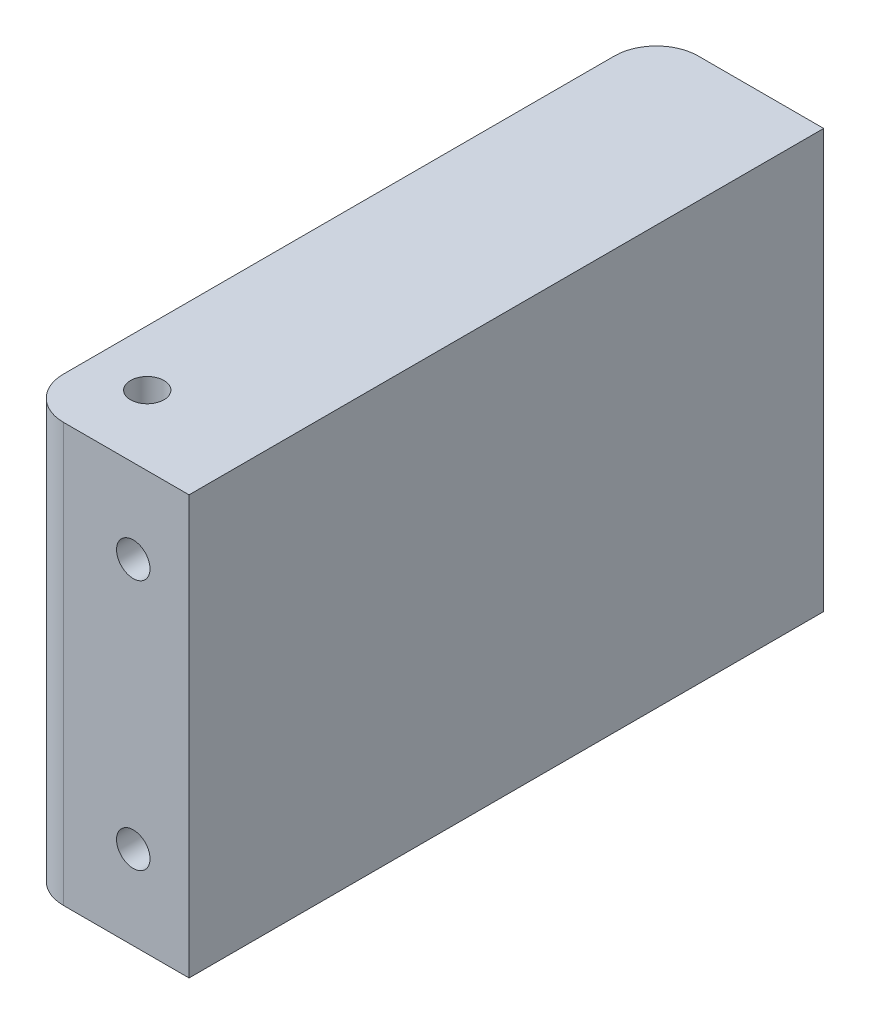
ISO-10303-21;
HEADER;
FILE_DESCRIPTION(('STEP AP214'),'2;1');
FILE_NAME('part.step','',(''),(''),'','','');
FILE_SCHEMA(('AUTOMOTIVE_DESIGN { 1 0 10303 214 1 1 1 1 }'));
ENDSEC;
DATA;
#1=APPLICATION_CONTEXT('core data for automotive mechanical design processes');
#2=APPLICATION_PROTOCOL_DEFINITION('international standard','automotive_design',2000,#1);
#3=PRODUCT_CONTEXT('',#1,'mechanical');
#4=PRODUCT('Part','Part','',(#3));
#5=PRODUCT_RELATED_PRODUCT_CATEGORY('part','',(#4));
#6=PRODUCT_DEFINITION_FORMATION('','',#4);
#7=PRODUCT_DEFINITION_CONTEXT('part definition',#1,'design');
#8=PRODUCT_DEFINITION('design','',#6,#7);
#9=PRODUCT_DEFINITION_SHAPE('','',#8);
#10=(LENGTH_UNIT() NAMED_UNIT(*) SI_UNIT(.MILLI.,.METRE.));
#11=(NAMED_UNIT(*) PLANE_ANGLE_UNIT() SI_UNIT($,.RADIAN.));
#12=(NAMED_UNIT(*) SI_UNIT($,.STERADIAN.) SOLID_ANGLE_UNIT());
#13=UNCERTAINTY_MEASURE_WITH_UNIT(LENGTH_MEASURE(1.E-05),#10,'distance_accuracy_value','');
#14=(GEOMETRIC_REPRESENTATION_CONTEXT(3) GLOBAL_UNCERTAINTY_ASSIGNED_CONTEXT((#13)) GLOBAL_UNIT_ASSIGNED_CONTEXT((#10,
#11,#12)) REPRESENTATION_CONTEXT('',''));
#15=CARTESIAN_POINT('',(0.,0.,0.));
#16=DIRECTION('',(0.,0.,1.));
#17=DIRECTION('',(1.,0.,0.));
#18=AXIS2_PLACEMENT_3D('',#15,#16,#17);
#19=CARTESIAN_POINT('',(0.,15.,0.));
#20=DIRECTION('',(0.,1.,0.));
#21=DIRECTION('',(0.,0.,1.));
#22=AXIS2_PLACEMENT_3D('',#19,#20,#21);
#23=PLANE('',#22);
#24=DIRECTION('',(-1.,0.,0.));
#25=VECTOR('',#24,1.);
#26=CARTESIAN_POINT('',(-6.,15.,-45.5));
#27=LINE('',#26,#25);
#28=CARTESIAN_POINT('',(6.,15.,-45.5));
#29=VERTEX_POINT('',#28);
#30=CARTESIAN_POINT('',(-3.,15.,-45.5));
#31=VERTEX_POINT('',#30);
#32=EDGE_CURVE('E112',#29,#31,#27,.T.);
#33=ORIENTED_EDGE('',*,*,#32,.T.);
#34=CARTESIAN_POINT('',(-3.,15.,-42.5));
#35=DIRECTION('',(0.,1.,0.));
#36=DIRECTION('',(0.,0.,1.));
#37=AXIS2_PLACEMENT_3D('',#34,#35,#36);
#38=CIRCLE('',#37,3.);
#39=CARTESIAN_POINT('',(-6.,15.,-42.5));
#40=VERTEX_POINT('',#39);
#41=EDGE_CURVE('E45',#31,#40,#38,.T.);
#42=ORIENTED_EDGE('',*,*,#41,.T.);
#43=DIRECTION('',(0.,0.,1.));
#44=VECTOR('',#43,1.);
#45=CARTESIAN_POINT('',(-6.,15.,-45.5));
#46=LINE('',#45,#44);
#47=CARTESIAN_POINT('',(-6.,15.,-3.));
#48=VERTEX_POINT('',#47);
#49=EDGE_CURVE('E98',#40,#48,#46,.T.);
#50=ORIENTED_EDGE('',*,*,#49,.T.);
#51=CARTESIAN_POINT('',(-3.,15.,-3.));
#52=DIRECTION('',(0.,1.,0.));
#53=DIRECTION('',(0.,0.,1.));
#54=AXIS2_PLACEMENT_3D('',#51,#52,#53);
#55=CIRCLE('',#54,3.);
#56=CARTESIAN_POINT('',(-3.,15.,0.));
#57=VERTEX_POINT('',#56);
#58=EDGE_CURVE('E52',#48,#57,#55,.T.);
#59=ORIENTED_EDGE('',*,*,#58,.T.);
#60=DIRECTION('',(1.,0.,0.));
#61=VECTOR('',#60,1.);
#62=CARTESIAN_POINT('',(-6.,15.,0.));
#63=LINE('',#62,#61);
#64=CARTESIAN_POINT('',(6.,15.,0.));
#65=VERTEX_POINT('',#64);
#66=EDGE_CURVE('E90',#57,#65,#63,.T.);
#67=ORIENTED_EDGE('',*,*,#66,.T.);
#68=DIRECTION('',(0.,0.,-1.));
#69=VECTOR('',#68,1.);
#70=CARTESIAN_POINT('',(6.,15.,-45.5));
#71=LINE('',#70,#69);
#72=EDGE_CURVE('E94',#65,#29,#71,.T.);
#73=ORIENTED_EDGE('',*,*,#72,.T.);
#74=EDGE_LOOP('',(#33,#42,#50,#59,#67,#73));
#75=FACE_BOUND('',#74,.T.);
#76=CARTESIAN_POINT('',(-2.,15.,-5.));
#77=DIRECTION('',(0.,1.,0.));
#78=DIRECTION('',(0.,0.,1.));
#79=AXIS2_PLACEMENT_3D('',#76,#77,#78);
#80=CIRCLE('',#79,1.2);
#81=CARTESIAN_POINT('',(-2.,15.,-3.8));
#82=VERTEX_POINT('',#81);
#83=EDGE_CURVE('E120',#82,#82,#80,.T.);
#84=ORIENTED_EDGE('',*,*,#83,.F.);
#85=EDGE_LOOP('',(#84));
#86=FACE_BOUND('',#85,.T.);
#87=ADVANCED_FACE('F37',(#75,#86),#23,.T.);
#88=CARTESIAN_POINT('',(0.,-15.,0.));
#89=DIRECTION('',(0.,1.,0.));
#90=DIRECTION('',(0.,0.,1.));
#91=AXIS2_PLACEMENT_3D('',#88,#89,#90);
#92=PLANE('',#91);
#93=DIRECTION('',(0.,0.,1.));
#94=VECTOR('',#93,1.);
#95=CARTESIAN_POINT('',(-6.,-15.,-45.5));
#96=LINE('',#95,#94);
#97=CARTESIAN_POINT('',(-6.,-15.,-42.5));
#98=VERTEX_POINT('',#97);
#99=CARTESIAN_POINT('',(-6.,-15.,-3.));
#100=VERTEX_POINT('',#99);
#101=EDGE_CURVE('E117',#98,#100,#96,.T.);
#102=ORIENTED_EDGE('',*,*,#101,.F.);
#103=CARTESIAN_POINT('',(-3.,-15.,-42.5));
#104=DIRECTION('',(0.,1.,0.));
#105=DIRECTION('',(0.,0.,1.));
#106=AXIS2_PLACEMENT_3D('',#103,#104,#105);
#107=CIRCLE('',#106,3.);
#108=CARTESIAN_POINT('',(-3.,-15.,-45.5));
#109=VERTEX_POINT('',#108);
#110=EDGE_CURVE('E133',#98,#109,#107,.F.);
#111=ORIENTED_EDGE('',*,*,#110,.T.);
#112=DIRECTION('',(-1.,0.,0.));
#113=VECTOR('',#112,1.);
#114=CARTESIAN_POINT('',(-6.,-15.,-45.5));
#115=LINE('',#114,#113);
#116=CARTESIAN_POINT('',(6.,-15.,-45.5));
#117=VERTEX_POINT('',#116);
#118=EDGE_CURVE('E124',#117,#109,#115,.T.);
#119=ORIENTED_EDGE('',*,*,#118,.F.);
#120=DIRECTION('',(0.,0.,-1.));
#121=VECTOR('',#120,1.);
#122=CARTESIAN_POINT('',(6.,-15.,-45.5));
#123=LINE('',#122,#121);
#124=CARTESIAN_POINT('',(6.,-15.,0.));
#125=VERTEX_POINT('',#124);
#126=EDGE_CURVE('E122',#125,#117,#123,.T.);
#127=ORIENTED_EDGE('',*,*,#126,.F.);
#128=DIRECTION('',(1.,0.,0.));
#129=VECTOR('',#128,1.);
#130=CARTESIAN_POINT('',(-6.,-15.,0.));
#131=LINE('',#130,#129);
#132=CARTESIAN_POINT('',(-3.,-15.,0.));
#133=VERTEX_POINT('',#132);
#134=EDGE_CURVE('E104',#133,#125,#131,.T.);
#135=ORIENTED_EDGE('',*,*,#134,.F.);
#136=CARTESIAN_POINT('',(-3.,-15.,-3.));
#137=DIRECTION('',(0.,1.,0.));
#138=DIRECTION('',(0.,0.,1.));
#139=AXIS2_PLACEMENT_3D('',#136,#137,#138);
#140=CIRCLE('',#139,3.);
#141=EDGE_CURVE('E131',#133,#100,#140,.F.);
#142=ORIENTED_EDGE('',*,*,#141,.T.);
#143=EDGE_LOOP('',(#102,#111,#119,#127,#135,#142));
#144=FACE_BOUND('',#143,.T.);
#145=CARTESIAN_POINT('',(-2.,-15.,-5.));
#146=DIRECTION('',(0.,1.,0.));
#147=DIRECTION('',(0.,0.,1.));
#148=AXIS2_PLACEMENT_3D('',#145,#146,#147);
#149=CIRCLE('',#148,1.2);
#150=CARTESIAN_POINT('',(-2.,-15.,-3.8));
#151=VERTEX_POINT('',#150);
#152=EDGE_CURVE('E194',#151,#151,#149,.T.);
#153=ORIENTED_EDGE('',*,*,#152,.T.);
#154=EDGE_LOOP('',(#153));
#155=FACE_BOUND('',#154,.T.);
#156=ADVANCED_FACE('F147',(#144,#155),#92,.F.);
#157=CARTESIAN_POINT('',(-6.,15.,-45.5));
#158=DIRECTION('',(1.,0.,0.));
#159=DIRECTION('',(0.,0.,-1.));
#160=AXIS2_PLACEMENT_3D('',#157,#158,#159);
#161=PLANE('',#160);
#162=ORIENTED_EDGE('',*,*,#49,.F.);
#163=DIRECTION('',(0.,-1.,0.));
#164=VECTOR('',#163,1.);
#165=CARTESIAN_POINT('',(-6.,15.,-42.5));
#166=LINE('',#165,#164);
#167=EDGE_CURVE('E128',#40,#98,#166,.T.);
#168=ORIENTED_EDGE('',*,*,#167,.T.);
#169=ORIENTED_EDGE('',*,*,#101,.T.);
#170=DIRECTION('',(0.,-1.,0.));
#171=VECTOR('',#170,1.);
#172=CARTESIAN_POINT('',(-6.,15.,-3.));
#173=LINE('',#172,#171);
#174=EDGE_CURVE('E107',#100,#48,#173,.F.);
#175=ORIENTED_EDGE('',*,*,#174,.T.);
#176=EDGE_LOOP('',(#162,#168,#169,#175));
#177=FACE_BOUND('',#176,.T.);
#178=ADVANCED_FACE('F141',(#177),#161,.F.);
#179=CARTESIAN_POINT('',(-6.,15.,0.));
#180=DIRECTION('',(0.,0.,-1.));
#181=DIRECTION('',(-1.,0.,0.));
#182=AXIS2_PLACEMENT_3D('',#179,#180,#181);
#183=PLANE('',#182);
#184=CARTESIAN_POINT('',(2.,-9.,0.));
#185=DIRECTION('',(0.,0.,1.));
#186=DIRECTION('',(-1.,0.,0.));
#187=AXIS2_PLACEMENT_3D('',#184,#185,#186);
#188=CIRCLE('',#187,1.2);
#189=CARTESIAN_POINT('',(0.799999999999998,-9.,0.));
#190=VERTEX_POINT('',#189);
#191=EDGE_CURVE('E185',#190,#190,#188,.T.);
#192=ORIENTED_EDGE('',*,*,#191,.F.);
#193=EDGE_LOOP('',(#192));
#194=FACE_BOUND('',#193,.T.);
#195=CARTESIAN_POINT('',(2.,9.,0.));
#196=DIRECTION('',(0.,0.,1.));
#197=DIRECTION('',(1.,0.,0.));
#198=AXIS2_PLACEMENT_3D('',#195,#196,#197);
#199=CIRCLE('',#198,1.2);
#200=CARTESIAN_POINT('',(3.2,9.,0.));
#201=VERTEX_POINT('',#200);
#202=EDGE_CURVE('E188',#201,#201,#199,.T.);
#203=ORIENTED_EDGE('',*,*,#202,.F.);
#204=EDGE_LOOP('',(#203));
#205=FACE_BOUND('',#204,.T.);
#206=ORIENTED_EDGE('',*,*,#66,.F.);
#207=DIRECTION('',(0.,-1.,0.));
#208=VECTOR('',#207,1.);
#209=CARTESIAN_POINT('',(-3.,15.,0.));
#210=LINE('',#209,#208);
#211=EDGE_CURVE('E11',#57,#133,#210,.T.);
#212=ORIENTED_EDGE('',*,*,#211,.T.);
#213=ORIENTED_EDGE('',*,*,#134,.T.);
#214=DIRECTION('',(0.,-1.,0.));
#215=VECTOR('',#214,1.);
#216=CARTESIAN_POINT('',(6.,15.,0.));
#217=LINE('',#216,#215);
#218=EDGE_CURVE('E101',#65,#125,#217,.T.);
#219=ORIENTED_EDGE('',*,*,#218,.F.);
#220=EDGE_LOOP('',(#206,#212,#213,#219));
#221=FACE_BOUND('',#220,.T.);
#222=ADVANCED_FACE('F102',(#194,#205,#221),#183,.F.);
#223=CARTESIAN_POINT('',(6.,15.,-45.5));
#224=DIRECTION('',(-1.,0.,0.));
#225=DIRECTION('',(0.,0.,1.));
#226=AXIS2_PLACEMENT_3D('',#223,#224,#225);
#227=PLANE('',#226);
#228=ORIENTED_EDGE('',*,*,#126,.T.);
#229=DIRECTION('',(0.,-1.,0.));
#230=VECTOR('',#229,1.);
#231=CARTESIAN_POINT('',(6.,15.,-45.5));
#232=LINE('',#231,#230);
#233=EDGE_CURVE('E108',#29,#117,#232,.T.);
#234=ORIENTED_EDGE('',*,*,#233,.F.);
#235=ORIENTED_EDGE('',*,*,#72,.F.);
#236=ORIENTED_EDGE('',*,*,#218,.T.);
#237=EDGE_LOOP('',(#228,#234,#235,#236));
#238=FACE_BOUND('',#237,.T.);
#239=ADVANCED_FACE('F110',(#238),#227,.F.);
#240=CARTESIAN_POINT('',(-6.,15.,-45.5));
#241=DIRECTION('',(0.,0.,1.));
#242=DIRECTION('',(1.,0.,0.));
#243=AXIS2_PLACEMENT_3D('',#240,#241,#242);
#244=PLANE('',#243);
#245=CARTESIAN_POINT('',(2.,-9.,-45.5));
#246=DIRECTION('',(0.,0.,1.));
#247=DIRECTION('',(-1.,0.,0.));
#248=AXIS2_PLACEMENT_3D('',#245,#246,#247);
#249=CIRCLE('',#248,1.2);
#250=CARTESIAN_POINT('',(0.799999999999998,-9.,-45.5));
#251=VERTEX_POINT('',#250);
#252=EDGE_CURVE('E182',#251,#251,#249,.T.);
#253=ORIENTED_EDGE('',*,*,#252,.T.);
#254=EDGE_LOOP('',(#253));
#255=FACE_BOUND('',#254,.T.);
#256=CARTESIAN_POINT('',(2.,9.,-45.5));
#257=DIRECTION('',(0.,0.,1.));
#258=DIRECTION('',(1.,0.,0.));
#259=AXIS2_PLACEMENT_3D('',#256,#257,#258);
#260=CIRCLE('',#259,1.2);
#261=CARTESIAN_POINT('',(3.2,9.,-45.5));
#262=VERTEX_POINT('',#261);
#263=EDGE_CURVE('E191',#262,#262,#260,.T.);
#264=ORIENTED_EDGE('',*,*,#263,.T.);
#265=EDGE_LOOP('',(#264));
#266=FACE_BOUND('',#265,.T.);
#267=ORIENTED_EDGE('',*,*,#118,.T.);
#268=DIRECTION('',(0.,-1.,0.));
#269=VECTOR('',#268,1.);
#270=CARTESIAN_POINT('',(-3.,15.,-45.5));
#271=LINE('',#270,#269);
#272=EDGE_CURVE('E60',#109,#31,#271,.F.);
#273=ORIENTED_EDGE('',*,*,#272,.T.);
#274=ORIENTED_EDGE('',*,*,#32,.F.);
#275=ORIENTED_EDGE('',*,*,#233,.T.);
#276=EDGE_LOOP('',(#267,#273,#274,#275));
#277=FACE_BOUND('',#276,.T.);
#278=ADVANCED_FACE('F149',(#255,#266,#277),#244,.F.);
#279=CARTESIAN_POINT('',(-2.,15.,-5.));
#280=DIRECTION('',(0.,-1.,0.));
#281=DIRECTION('',(0.,0.,-1.));
#282=AXIS2_PLACEMENT_3D('',#279,#280,#281);
#283=CYLINDRICAL_SURFACE('',#282,1.2);
#284=ORIENTED_EDGE('',*,*,#83,.T.);
#285=EDGE_LOOP('',(#284));
#286=FACE_BOUND('',#285,.T.);
#287=ORIENTED_EDGE('',*,*,#152,.F.);
#288=EDGE_LOOP('',(#287));
#289=FACE_BOUND('',#288,.T.);
#290=ADVANCED_FACE('F151',(#286,#289),#283,.F.);
#291=CARTESIAN_POINT('',(2.,9.,-45.5));
#292=DIRECTION('',(0.,0.,1.));
#293=DIRECTION('',(1.,0.,0.));
#294=AXIS2_PLACEMENT_3D('',#291,#292,#293);
#295=CYLINDRICAL_SURFACE('',#294,1.2);
#296=ORIENTED_EDGE('',*,*,#263,.F.);
#297=EDGE_LOOP('',(#296));
#298=FACE_BOUND('',#297,.T.);
#299=ORIENTED_EDGE('',*,*,#202,.T.);
#300=EDGE_LOOP('',(#299));
#301=FACE_BOUND('',#300,.T.);
#302=ADVANCED_FACE('F158',(#298,#301),#295,.F.);
#303=CARTESIAN_POINT('',(2.,-9.,-45.5));
#304=DIRECTION('',(0.,0.,1.));
#305=DIRECTION('',(1.,0.,0.));
#306=AXIS2_PLACEMENT_3D('',#303,#304,#305);
#307=CYLINDRICAL_SURFACE('',#306,1.2);
#308=ORIENTED_EDGE('',*,*,#252,.F.);
#309=EDGE_LOOP('',(#308));
#310=FACE_BOUND('',#309,.T.);
#311=ORIENTED_EDGE('',*,*,#191,.T.);
#312=EDGE_LOOP('',(#311));
#313=FACE_BOUND('',#312,.T.);
#314=ADVANCED_FACE('F173',(#310,#313),#307,.F.);
#315=CARTESIAN_POINT('',(-3.,15.,-42.5));
#316=DIRECTION('',(0.,-1.,0.));
#317=DIRECTION('',(0.,0.,-1.));
#318=AXIS2_PLACEMENT_3D('',#315,#316,#317);
#319=CYLINDRICAL_SURFACE('',#318,3.);
#320=ORIENTED_EDGE('',*,*,#41,.F.);
#321=ORIENTED_EDGE('',*,*,#272,.F.);
#322=ORIENTED_EDGE('',*,*,#110,.F.);
#323=ORIENTED_EDGE('',*,*,#167,.F.);
#324=EDGE_LOOP('',(#320,#321,#322,#323));
#325=FACE_BOUND('',#324,.T.);
#326=ADVANCED_FACE('F144',(#325),#319,.T.);
#327=CARTESIAN_POINT('',(-3.,15.,-3.));
#328=DIRECTION('',(0.,-1.,0.));
#329=DIRECTION('',(0.,0.,-1.));
#330=AXIS2_PLACEMENT_3D('',#327,#328,#329);
#331=CYLINDRICAL_SURFACE('',#330,3.);
#332=ORIENTED_EDGE('',*,*,#58,.F.);
#333=ORIENTED_EDGE('',*,*,#174,.F.);
#334=ORIENTED_EDGE('',*,*,#141,.F.);
#335=ORIENTED_EDGE('',*,*,#211,.F.);
#336=EDGE_LOOP('',(#332,#333,#334,#335));
#337=FACE_BOUND('',#336,.T.);
#338=ADVANCED_FACE('F39',(#337),#331,.T.);
#339=CLOSED_SHELL('',(#87,#156,#178,#222,#239,#278,#290,#302,#314,#326,#338));
#340=MANIFOLD_SOLID_BREP('B2',#339);
#341=ADVANCED_BREP_SHAPE_REPRESENTATION('',(#18,#340),#14);
#342=SHAPE_DEFINITION_REPRESENTATION(#9,#341);
ENDSEC;
END-ISO-10303-21;
